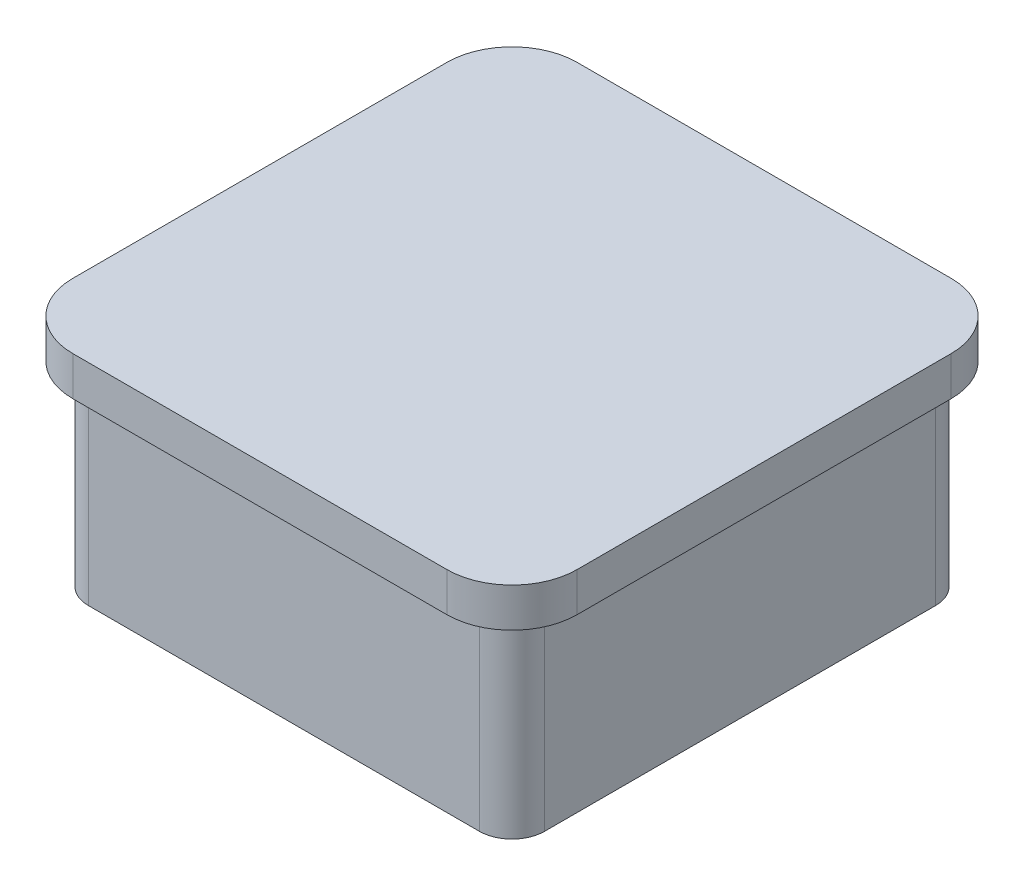
ISO-10303-21;
HEADER;
FILE_DESCRIPTION(('STEP AP214'),'2;1');
FILE_NAME('part.step','',(''),(''),'','','');
FILE_SCHEMA(('AUTOMOTIVE_DESIGN { 1 0 10303 214 1 1 1 1 }'));
ENDSEC;
DATA;
#1=APPLICATION_CONTEXT('core data for automotive mechanical design processes');
#2=APPLICATION_PROTOCOL_DEFINITION('international standard','automotive_design',2000,#1);
#3=PRODUCT_CONTEXT('',#1,'mechanical');
#4=PRODUCT('Part','Part','',(#3));
#5=PRODUCT_RELATED_PRODUCT_CATEGORY('part','',(#4));
#6=PRODUCT_DEFINITION_FORMATION('','',#4);
#7=PRODUCT_DEFINITION_CONTEXT('part definition',#1,'design');
#8=PRODUCT_DEFINITION('design','',#6,#7);
#9=PRODUCT_DEFINITION_SHAPE('','',#8);
#10=(LENGTH_UNIT() NAMED_UNIT(*) SI_UNIT(.MILLI.,.METRE.));
#11=(NAMED_UNIT(*) PLANE_ANGLE_UNIT() SI_UNIT($,.RADIAN.));
#12=(NAMED_UNIT(*) SI_UNIT($,.STERADIAN.) SOLID_ANGLE_UNIT());
#13=UNCERTAINTY_MEASURE_WITH_UNIT(LENGTH_MEASURE(1.E-05),#10,'distance_accuracy_value','');
#14=(GEOMETRIC_REPRESENTATION_CONTEXT(3) GLOBAL_UNCERTAINTY_ASSIGNED_CONTEXT((#13)) GLOBAL_UNIT_ASSIGNED_CONTEXT((#10,
#11,#12)) REPRESENTATION_CONTEXT('',''));
#15=CARTESIAN_POINT('',(0.,0.,0.));
#16=DIRECTION('',(0.,0.,1.));
#17=DIRECTION('',(1.,0.,0.));
#18=AXIS2_PLACEMENT_3D('',#15,#16,#17);
#19=CARTESIAN_POINT('',(0.,-6.,0.));
#20=DIRECTION('',(0.,-1.,0.));
#21=DIRECTION('',(0.,0.,-1.));
#22=AXIS2_PLACEMENT_3D('',#19,#20,#21);
#23=PLANE('',#22);
#24=DIRECTION('',(0.,0.,1.));
#25=VECTOR('',#24,1.);
#26=CARTESIAN_POINT('',(-38.7,-6.,38.7));
#27=LINE('',#26,#25);
#28=CARTESIAN_POINT('',(-38.7,-6.,-28.7));
#29=VERTEX_POINT('',#28);
#30=CARTESIAN_POINT('',(-38.7,-6.,28.7));
#31=VERTEX_POINT('',#30);
#32=EDGE_CURVE('E330',#29,#31,#27,.T.);
#33=ORIENTED_EDGE('',*,*,#32,.F.);
#34=CARTESIAN_POINT('',(-28.7,-6.,-28.7));
#35=DIRECTION('',(0.,-1.,0.));
#36=DIRECTION('',(0.,0.,-1.));
#37=AXIS2_PLACEMENT_3D('',#34,#35,#36);
#38=CIRCLE('',#37,10.);
#39=CARTESIAN_POINT('',(-28.7,-6.,-38.7));
#40=VERTEX_POINT('',#39);
#41=EDGE_CURVE('E368',#29,#40,#38,.T.);
#42=ORIENTED_EDGE('',*,*,#41,.T.);
#43=DIRECTION('',(-1.,0.,0.));
#44=VECTOR('',#43,1.);
#45=CARTESIAN_POINT('',(-38.7,-6.,-38.7));
#46=LINE('',#45,#44);
#47=CARTESIAN_POINT('',(28.7,-6.,-38.7));
#48=VERTEX_POINT('',#47);
#49=EDGE_CURVE('E326',#48,#40,#46,.T.);
#50=ORIENTED_EDGE('',*,*,#49,.F.);
#51=CARTESIAN_POINT('',(28.7,-6.,-28.7));
#52=DIRECTION('',(0.,-1.,0.));
#53=DIRECTION('',(0.,0.,-1.));
#54=AXIS2_PLACEMENT_3D('',#51,#52,#53);
#55=CIRCLE('',#54,10.);
#56=CARTESIAN_POINT('',(38.7,-6.,-28.7));
#57=VERTEX_POINT('',#56);
#58=EDGE_CURVE('E366',#48,#57,#55,.T.);
#59=ORIENTED_EDGE('',*,*,#58,.T.);
#60=DIRECTION('',(0.,0.,-1.));
#61=VECTOR('',#60,1.);
#62=CARTESIAN_POINT('',(38.7,-6.,38.7));
#63=LINE('',#62,#61);
#64=CARTESIAN_POINT('',(38.7,-6.,28.7));
#65=VERTEX_POINT('',#64);
#66=EDGE_CURVE('E323',#65,#57,#63,.T.);
#67=ORIENTED_EDGE('',*,*,#66,.F.);
#68=CARTESIAN_POINT('',(28.7,-6.,28.7));
#69=DIRECTION('',(0.,-1.,0.));
#70=DIRECTION('',(0.,0.,-1.));
#71=AXIS2_PLACEMENT_3D('',#68,#69,#70);
#72=CIRCLE('',#71,10.);
#73=CARTESIAN_POINT('',(28.7,-6.,38.7));
#74=VERTEX_POINT('',#73);
#75=EDGE_CURVE('E47',#65,#74,#72,.T.);
#76=ORIENTED_EDGE('',*,*,#75,.T.);
#77=DIRECTION('',(1.,0.,0.));
#78=VECTOR('',#77,1.);
#79=CARTESIAN_POINT('',(-38.7,-6.,38.7));
#80=LINE('',#79,#78);
#81=CARTESIAN_POINT('',(-28.7,-6.,38.7));
#82=VERTEX_POINT('',#81);
#83=EDGE_CURVE('E333',#82,#74,#80,.T.);
#84=ORIENTED_EDGE('',*,*,#83,.F.);
#85=CARTESIAN_POINT('',(-28.7,-6.,28.7));
#86=DIRECTION('',(0.,-1.,0.));
#87=DIRECTION('',(0.,0.,-1.));
#88=AXIS2_PLACEMENT_3D('',#85,#86,#87);
#89=CIRCLE('',#88,10.);
#90=EDGE_CURVE('E363',#82,#31,#89,.T.);
#91=ORIENTED_EDGE('',*,*,#90,.T.);
#92=EDGE_LOOP('',(#33,#42,#50,#59,#67,#76,#84,#91));
#93=FACE_BOUND('',#92,.T.);
#94=DIRECTION('',(0.,0.,-1.));
#95=VECTOR('',#94,1.);
#96=CARTESIAN_POINT('',(-35.,-6.,-30.));
#97=LINE('',#96,#95);
#98=CARTESIAN_POINT('',(-35.,-6.,30.));
#99=VERTEX_POINT('',#98);
#100=CARTESIAN_POINT('',(-35.,-6.,-30.));
#101=VERTEX_POINT('',#100);
#102=EDGE_CURVE('E287',#99,#101,#97,.T.);
#103=ORIENTED_EDGE('',*,*,#102,.F.);
#104=CARTESIAN_POINT('',(-30.,-6.,30.));
#105=DIRECTION('',(0.,-1.,0.));
#106=DIRECTION('',(0.,0.,-1.));
#107=AXIS2_PLACEMENT_3D('',#104,#105,#106);
#108=CIRCLE('',#107,5.);
#109=CARTESIAN_POINT('',(-30.,-6.,35.));
#110=VERTEX_POINT('',#109);
#111=EDGE_CURVE('E214',#110,#99,#108,.T.);
#112=ORIENTED_EDGE('',*,*,#111,.F.);
#113=DIRECTION('',(-1.,0.,0.));
#114=VECTOR('',#113,1.);
#115=CARTESIAN_POINT('',(-30.,-6.,35.));
#116=LINE('',#115,#114);
#117=CARTESIAN_POINT('',(30.,-6.,35.));
#118=VERTEX_POINT('',#117);
#119=EDGE_CURVE('E270',#118,#110,#116,.T.);
#120=ORIENTED_EDGE('',*,*,#119,.F.);
#121=CARTESIAN_POINT('',(30.,-6.,30.));
#122=DIRECTION('',(0.,-1.,0.));
#123=DIRECTION('',(0.,0.,-1.));
#124=AXIS2_PLACEMENT_3D('',#121,#122,#123);
#125=CIRCLE('',#124,5.);
#126=CARTESIAN_POINT('',(35.,-6.,30.));
#127=VERTEX_POINT('',#126);
#128=EDGE_CURVE('E297',#127,#118,#125,.T.);
#129=ORIENTED_EDGE('',*,*,#128,.F.);
#130=DIRECTION('',(0.,0.,1.));
#131=VECTOR('',#130,1.);
#132=CARTESIAN_POINT('',(35.,-6.,-30.));
#133=LINE('',#132,#131);
#134=CARTESIAN_POINT('',(35.,-6.,-30.));
#135=VERTEX_POINT('',#134);
#136=EDGE_CURVE('E295',#135,#127,#133,.T.);
#137=ORIENTED_EDGE('',*,*,#136,.F.);
#138=CARTESIAN_POINT('',(30.,-6.,-30.));
#139=DIRECTION('',(0.,-1.,0.));
#140=DIRECTION('',(0.,0.,1.));
#141=AXIS2_PLACEMENT_3D('',#138,#139,#140);
#142=CIRCLE('',#141,5.);
#143=CARTESIAN_POINT('',(30.,-6.,-35.));
#144=VERTEX_POINT('',#143);
#145=EDGE_CURVE('E293',#144,#135,#142,.T.);
#146=ORIENTED_EDGE('',*,*,#145,.F.);
#147=DIRECTION('',(1.,0.,0.));
#148=VECTOR('',#147,1.);
#149=CARTESIAN_POINT('',(-30.,-6.,-35.));
#150=LINE('',#149,#148);
#151=CARTESIAN_POINT('',(-30.,-6.,-35.));
#152=VERTEX_POINT('',#151);
#153=EDGE_CURVE('E291',#152,#144,#150,.T.);
#154=ORIENTED_EDGE('',*,*,#153,.F.);
#155=CARTESIAN_POINT('',(-30.,-6.,-30.));
#156=DIRECTION('',(0.,-1.,0.));
#157=DIRECTION('',(0.,0.,-1.));
#158=AXIS2_PLACEMENT_3D('',#155,#156,#157);
#159=CIRCLE('',#158,5.);
#160=EDGE_CURVE('E289',#101,#152,#159,.T.);
#161=ORIENTED_EDGE('',*,*,#160,.F.);
#162=EDGE_LOOP('',(#103,#112,#120,#129,#137,#146,#154,#161));
#163=FACE_BOUND('',#162,.T.);
#164=ADVANCED_FACE('F32',(#93,#163),#23,.T.);
#165=CARTESIAN_POINT('',(38.7,-6.,38.7));
#166=DIRECTION('',(1.,0.,0.));
#167=DIRECTION('',(0.,0.,-1.));
#168=AXIS2_PLACEMENT_3D('',#165,#166,#167);
#169=PLANE('',#168);
#170=ORIENTED_EDGE('',*,*,#66,.T.);
#171=DIRECTION('',(0.,1.,0.));
#172=VECTOR('',#171,1.);
#173=CARTESIAN_POINT('',(38.7,-6.,-28.7));
#174=LINE('',#173,#172);
#175=CARTESIAN_POINT('',(38.7,0.,-28.7));
#176=VERTEX_POINT('',#175);
#177=EDGE_CURVE('E372',#57,#176,#174,.T.);
#178=ORIENTED_EDGE('',*,*,#177,.T.);
#179=DIRECTION('',(0.,0.,-1.));
#180=VECTOR('',#179,1.);
#181=CARTESIAN_POINT('',(38.7,0.,38.7));
#182=LINE('',#181,#180);
#183=CARTESIAN_POINT('',(38.7,0.,28.7));
#184=VERTEX_POINT('',#183);
#185=EDGE_CURVE('E322',#184,#176,#182,.T.);
#186=ORIENTED_EDGE('',*,*,#185,.F.);
#187=DIRECTION('',(0.,1.,0.));
#188=VECTOR('',#187,1.);
#189=CARTESIAN_POINT('',(38.7,-6.,28.7));
#190=LINE('',#189,#188);
#191=EDGE_CURVE('E370',#184,#65,#190,.F.);
#192=ORIENTED_EDGE('',*,*,#191,.T.);
#193=EDGE_LOOP('',(#170,#178,#186,#192));
#194=FACE_BOUND('',#193,.T.);
#195=ADVANCED_FACE('F377',(#194),#169,.T.);
#196=CARTESIAN_POINT('',(-38.7,-6.,38.7));
#197=DIRECTION('',(0.,0.,1.));
#198=DIRECTION('',(1.,0.,0.));
#199=AXIS2_PLACEMENT_3D('',#196,#197,#198);
#200=PLANE('',#199);
#201=ORIENTED_EDGE('',*,*,#83,.T.);
#202=DIRECTION('',(0.,1.,0.));
#203=VECTOR('',#202,1.);
#204=CARTESIAN_POINT('',(28.7,-6.,38.7));
#205=LINE('',#204,#203);
#206=CARTESIAN_POINT('',(28.7,0.,38.7));
#207=VERTEX_POINT('',#206);
#208=EDGE_CURVE('E11',#74,#207,#205,.T.);
#209=ORIENTED_EDGE('',*,*,#208,.T.);
#210=DIRECTION('',(1.,0.,0.));
#211=VECTOR('',#210,1.);
#212=CARTESIAN_POINT('',(-38.7,0.,38.7));
#213=LINE('',#212,#211);
#214=CARTESIAN_POINT('',(-28.7,0.,38.7));
#215=VERTEX_POINT('',#214);
#216=EDGE_CURVE('E327',#215,#207,#213,.T.);
#217=ORIENTED_EDGE('',*,*,#216,.F.);
#218=DIRECTION('',(0.,1.,0.));
#219=VECTOR('',#218,1.);
#220=CARTESIAN_POINT('',(-28.7,-6.,38.7));
#221=LINE('',#220,#219);
#222=EDGE_CURVE('E40',#215,#82,#221,.F.);
#223=ORIENTED_EDGE('',*,*,#222,.T.);
#224=EDGE_LOOP('',(#201,#209,#217,#223));
#225=FACE_BOUND('',#224,.T.);
#226=ADVANCED_FACE('F387',(#225),#200,.T.);
#227=CARTESIAN_POINT('',(-38.7,-6.,38.7));
#228=DIRECTION('',(-1.,0.,0.));
#229=DIRECTION('',(0.,0.,1.));
#230=AXIS2_PLACEMENT_3D('',#227,#228,#229);
#231=PLANE('',#230);
#232=DIRECTION('',(0.,0.,1.));
#233=VECTOR('',#232,1.);
#234=CARTESIAN_POINT('',(-38.7,0.,38.7));
#235=LINE('',#234,#233);
#236=CARTESIAN_POINT('',(-38.7,0.,-28.7));
#237=VERTEX_POINT('',#236);
#238=CARTESIAN_POINT('',(-38.7,0.,28.7));
#239=VERTEX_POINT('',#238);
#240=EDGE_CURVE('E341',#237,#239,#235,.T.);
#241=ORIENTED_EDGE('',*,*,#240,.F.);
#242=DIRECTION('',(0.,1.,0.));
#243=VECTOR('',#242,1.);
#244=CARTESIAN_POINT('',(-38.7,-6.,-28.7));
#245=LINE('',#244,#243);
#246=EDGE_CURVE('E361',#237,#29,#245,.F.);
#247=ORIENTED_EDGE('',*,*,#246,.T.);
#248=ORIENTED_EDGE('',*,*,#32,.T.);
#249=DIRECTION('',(0.,1.,0.));
#250=VECTOR('',#249,1.);
#251=CARTESIAN_POINT('',(-38.7,-6.,28.7));
#252=LINE('',#251,#250);
#253=EDGE_CURVE('E358',#31,#239,#252,.T.);
#254=ORIENTED_EDGE('',*,*,#253,.T.);
#255=EDGE_LOOP('',(#241,#247,#248,#254));
#256=FACE_BOUND('',#255,.T.);
#257=ADVANCED_FACE('F395',(#256),#231,.T.);
#258=CARTESIAN_POINT('',(-38.7,-6.,-38.7));
#259=DIRECTION('',(0.,0.,-1.));
#260=DIRECTION('',(-1.,0.,0.));
#261=AXIS2_PLACEMENT_3D('',#258,#259,#260);
#262=PLANE('',#261);
#263=ORIENTED_EDGE('',*,*,#49,.T.);
#264=DIRECTION('',(0.,1.,0.));
#265=VECTOR('',#264,1.);
#266=CARTESIAN_POINT('',(-28.7,-6.,-38.7));
#267=LINE('',#266,#265);
#268=CARTESIAN_POINT('',(-28.7,0.,-38.7));
#269=VERTEX_POINT('',#268);
#270=EDGE_CURVE('E347',#40,#269,#267,.T.);
#271=ORIENTED_EDGE('',*,*,#270,.T.);
#272=DIRECTION('',(-1.,0.,0.));
#273=VECTOR('',#272,1.);
#274=CARTESIAN_POINT('',(-38.7,0.,-38.7));
#275=LINE('',#274,#273);
#276=CARTESIAN_POINT('',(28.7,0.,-38.7));
#277=VERTEX_POINT('',#276);
#278=EDGE_CURVE('E338',#277,#269,#275,.T.);
#279=ORIENTED_EDGE('',*,*,#278,.F.);
#280=DIRECTION('',(0.,1.,0.));
#281=VECTOR('',#280,1.);
#282=CARTESIAN_POINT('',(28.7,-6.,-38.7));
#283=LINE('',#282,#281);
#284=EDGE_CURVE('E335',#277,#48,#283,.F.);
#285=ORIENTED_EDGE('',*,*,#284,.T.);
#286=EDGE_LOOP('',(#263,#271,#279,#285));
#287=FACE_BOUND('',#286,.T.);
#288=ADVANCED_FACE('F402',(#287),#262,.T.);
#289=CARTESIAN_POINT('',(0.,0.,0.));
#290=DIRECTION('',(0.,-1.,0.));
#291=DIRECTION('',(0.,0.,-1.));
#292=AXIS2_PLACEMENT_3D('',#289,#290,#291);
#293=PLANE('',#292);
#294=ORIENTED_EDGE('',*,*,#278,.T.);
#295=CARTESIAN_POINT('',(-28.7,0.,-28.7));
#296=DIRECTION('',(0.,-1.,0.));
#297=DIRECTION('',(0.,0.,-1.));
#298=AXIS2_PLACEMENT_3D('',#295,#296,#297);
#299=CIRCLE('',#298,10.);
#300=EDGE_CURVE('E356',#269,#237,#299,.F.);
#301=ORIENTED_EDGE('',*,*,#300,.T.);
#302=ORIENTED_EDGE('',*,*,#240,.T.);
#303=CARTESIAN_POINT('',(-28.7,0.,28.7));
#304=DIRECTION('',(0.,-1.,0.));
#305=DIRECTION('',(0.,0.,-1.));
#306=AXIS2_PLACEMENT_3D('',#303,#304,#305);
#307=CIRCLE('',#306,10.);
#308=EDGE_CURVE('E350',#239,#215,#307,.F.);
#309=ORIENTED_EDGE('',*,*,#308,.T.);
#310=ORIENTED_EDGE('',*,*,#216,.T.);
#311=CARTESIAN_POINT('',(28.7,0.,28.7));
#312=DIRECTION('',(0.,-1.,0.));
#313=DIRECTION('',(0.,0.,-1.));
#314=AXIS2_PLACEMENT_3D('',#311,#312,#313);
#315=CIRCLE('',#314,10.);
#316=EDGE_CURVE('E352',#207,#184,#315,.F.);
#317=ORIENTED_EDGE('',*,*,#316,.T.);
#318=ORIENTED_EDGE('',*,*,#185,.T.);
#319=CARTESIAN_POINT('',(28.7,0.,-28.7));
#320=DIRECTION('',(0.,-1.,0.));
#321=DIRECTION('',(0.,0.,-1.));
#322=AXIS2_PLACEMENT_3D('',#319,#320,#321);
#323=CIRCLE('',#322,10.);
#324=EDGE_CURVE('E354',#176,#277,#323,.F.);
#325=ORIENTED_EDGE('',*,*,#324,.T.);
#326=EDGE_LOOP('',(#294,#301,#302,#309,#310,#317,#318,#325));
#327=FACE_BOUND('',#326,.T.);
#328=ADVANCED_FACE('F382',(#327),#293,.F.);
#329=CARTESIAN_POINT('',(-30.,-36.,30.));
#330=DIRECTION('',(0.,-1.,0.));
#331=DIRECTION('',(0.,0.,-1.));
#332=AXIS2_PLACEMENT_3D('',#329,#330,#331);
#333=PLANE('',#332);
#334=CARTESIAN_POINT('',(-30.,-36.,30.));
#335=DIRECTION('',(0.,-1.,0.));
#336=DIRECTION('',(0.,0.,-1.));
#337=AXIS2_PLACEMENT_3D('',#334,#335,#336);
#338=CIRCLE('',#337,5.);
#339=CARTESIAN_POINT('',(-30.,-36.,35.));
#340=VERTEX_POINT('',#339);
#341=CARTESIAN_POINT('',(-35.,-36.,30.));
#342=VERTEX_POINT('',#341);
#343=EDGE_CURVE('E266',#340,#342,#338,.T.);
#344=ORIENTED_EDGE('',*,*,#343,.T.);
#345=DIRECTION('',(0.,0.,-1.));
#346=VECTOR('',#345,1.);
#347=CARTESIAN_POINT('',(-35.,-36.,-30.));
#348=LINE('',#347,#346);
#349=CARTESIAN_POINT('',(-35.,-36.,-30.));
#350=VERTEX_POINT('',#349);
#351=EDGE_CURVE('E269',#342,#350,#348,.T.);
#352=ORIENTED_EDGE('',*,*,#351,.T.);
#353=CARTESIAN_POINT('',(-30.,-36.,-30.));
#354=DIRECTION('',(0.,-1.,0.));
#355=DIRECTION('',(0.,0.,-1.));
#356=AXIS2_PLACEMENT_3D('',#353,#354,#355);
#357=CIRCLE('',#356,5.);
#358=CARTESIAN_POINT('',(-30.,-36.,-35.));
#359=VERTEX_POINT('',#358);
#360=EDGE_CURVE('E272',#350,#359,#357,.T.);
#361=ORIENTED_EDGE('',*,*,#360,.T.);
#362=DIRECTION('',(1.,0.,0.));
#363=VECTOR('',#362,1.);
#364=CARTESIAN_POINT('',(-30.,-36.,-35.));
#365=LINE('',#364,#363);
#366=CARTESIAN_POINT('',(30.,-36.,-35.));
#367=VERTEX_POINT('',#366);
#368=EDGE_CURVE('E274',#359,#367,#365,.T.);
#369=ORIENTED_EDGE('',*,*,#368,.T.);
#370=CARTESIAN_POINT('',(30.,-36.,-30.));
#371=DIRECTION('',(0.,-1.,0.));
#372=DIRECTION('',(0.,0.,1.));
#373=AXIS2_PLACEMENT_3D('',#370,#371,#372);
#374=CIRCLE('',#373,5.);
#375=CARTESIAN_POINT('',(35.,-36.,-30.));
#376=VERTEX_POINT('',#375);
#377=EDGE_CURVE('E276',#367,#376,#374,.T.);
#378=ORIENTED_EDGE('',*,*,#377,.T.);
#379=DIRECTION('',(0.,0.,1.));
#380=VECTOR('',#379,1.);
#381=CARTESIAN_POINT('',(35.,-36.,-30.));
#382=LINE('',#381,#380);
#383=CARTESIAN_POINT('',(35.,-36.,30.));
#384=VERTEX_POINT('',#383);
#385=EDGE_CURVE('E278',#376,#384,#382,.T.);
#386=ORIENTED_EDGE('',*,*,#385,.T.);
#387=CARTESIAN_POINT('',(30.,-36.,30.));
#388=DIRECTION('',(0.,-1.,0.));
#389=DIRECTION('',(0.,0.,-1.));
#390=AXIS2_PLACEMENT_3D('',#387,#388,#389);
#391=CIRCLE('',#390,5.);
#392=CARTESIAN_POINT('',(30.,-36.,35.));
#393=VERTEX_POINT('',#392);
#394=EDGE_CURVE('E280',#384,#393,#391,.T.);
#395=ORIENTED_EDGE('',*,*,#394,.T.);
#396=DIRECTION('',(-1.,0.,0.));
#397=VECTOR('',#396,1.);
#398=CARTESIAN_POINT('',(-30.,-36.,35.));
#399=LINE('',#398,#397);
#400=EDGE_CURVE('E282',#393,#340,#399,.T.);
#401=ORIENTED_EDGE('',*,*,#400,.T.);
#402=EDGE_LOOP('',(#344,#352,#361,#369,#378,#386,#395,#401));
#403=FACE_BOUND('',#402,.T.);
#404=DIRECTION('',(1.,0.,0.));
#405=VECTOR('',#404,1.);
#406=CARTESIAN_POINT('',(-30.,-36.,-33.));
#407=LINE('',#406,#405);
#408=CARTESIAN_POINT('',(-30.,-36.,-33.));
#409=VERTEX_POINT('',#408);
#410=CARTESIAN_POINT('',(30.,-36.,-33.));
#411=VERTEX_POINT('',#410);
#412=EDGE_CURVE('E205',#409,#411,#407,.T.);
#413=ORIENTED_EDGE('',*,*,#412,.F.);
#414=CARTESIAN_POINT('',(-30.,-36.,-30.));
#415=DIRECTION('',(0.,-1.,0.));
#416=DIRECTION('',(0.,0.,-1.));
#417=AXIS2_PLACEMENT_3D('',#414,#415,#416);
#418=CIRCLE('',#417,3.);
#419=CARTESIAN_POINT('',(-33.,-36.,-30.));
#420=VERTEX_POINT('',#419);
#421=EDGE_CURVE('E195',#420,#409,#418,.T.);
#422=ORIENTED_EDGE('',*,*,#421,.F.);
#423=DIRECTION('',(0.,0.,-1.));
#424=VECTOR('',#423,1.);
#425=CARTESIAN_POINT('',(-33.,-36.,-30.));
#426=LINE('',#425,#424);
#427=CARTESIAN_POINT('',(-33.,-36.,30.));
#428=VERTEX_POINT('',#427);
#429=EDGE_CURVE('E233',#428,#420,#426,.T.);
#430=ORIENTED_EDGE('',*,*,#429,.F.);
#431=CARTESIAN_POINT('',(-30.,-36.,30.));
#432=DIRECTION('',(0.,-1.,0.));
#433=DIRECTION('',(0.,0.,-1.));
#434=AXIS2_PLACEMENT_3D('',#431,#432,#433);
#435=CIRCLE('',#434,3.);
#436=CARTESIAN_POINT('',(-30.,-36.,33.));
#437=VERTEX_POINT('',#436);
#438=EDGE_CURVE('E230',#437,#428,#435,.T.);
#439=ORIENTED_EDGE('',*,*,#438,.F.);
#440=DIRECTION('',(-1.,0.,0.));
#441=VECTOR('',#440,1.);
#442=CARTESIAN_POINT('',(-30.,-36.,33.));
#443=LINE('',#442,#441);
#444=CARTESIAN_POINT('',(30.,-36.,33.));
#445=VERTEX_POINT('',#444);
#446=EDGE_CURVE('E228',#445,#437,#443,.T.);
#447=ORIENTED_EDGE('',*,*,#446,.F.);
#448=CARTESIAN_POINT('',(30.,-36.,30.));
#449=DIRECTION('',(0.,-1.,0.));
#450=DIRECTION('',(0.,0.,-1.));
#451=AXIS2_PLACEMENT_3D('',#448,#449,#450);
#452=CIRCLE('',#451,3.);
#453=CARTESIAN_POINT('',(33.,-36.,30.));
#454=VERTEX_POINT('',#453);
#455=EDGE_CURVE('E226',#454,#445,#452,.T.);
#456=ORIENTED_EDGE('',*,*,#455,.F.);
#457=DIRECTION('',(0.,0.,1.));
#458=VECTOR('',#457,1.);
#459=CARTESIAN_POINT('',(33.,-36.,-30.));
#460=LINE('',#459,#458);
#461=CARTESIAN_POINT('',(33.,-36.,-30.));
#462=VERTEX_POINT('',#461);
#463=EDGE_CURVE('E222',#462,#454,#460,.T.);
#464=ORIENTED_EDGE('',*,*,#463,.F.);
#465=CARTESIAN_POINT('',(30.,-36.,-30.));
#466=DIRECTION('',(0.,-1.,0.));
#467=DIRECTION('',(0.,0.,1.));
#468=AXIS2_PLACEMENT_3D('',#465,#466,#467);
#469=CIRCLE('',#468,3.);
#470=EDGE_CURVE('E220',#411,#462,#469,.T.);
#471=ORIENTED_EDGE('',*,*,#470,.F.);
#472=EDGE_LOOP('',(#413,#422,#430,#439,#447,#456,#464,#471));
#473=FACE_BOUND('',#472,.T.);
#474=ADVANCED_FACE('F218',(#403,#473),#333,.T.);
#475=CARTESIAN_POINT('',(-30.,-36.,30.));
#476=DIRECTION('',(0.,1.,0.));
#477=DIRECTION('',(0.,0.,1.));
#478=AXIS2_PLACEMENT_3D('',#475,#476,#477);
#479=CYLINDRICAL_SURFACE('',#478,5.);
#480=ORIENTED_EDGE('',*,*,#111,.T.);
#481=DIRECTION('',(0.,1.,0.));
#482=VECTOR('',#481,1.);
#483=CARTESIAN_POINT('',(-35.,-36.,30.));
#484=LINE('',#483,#482);
#485=EDGE_CURVE('E320',#342,#99,#484,.T.);
#486=ORIENTED_EDGE('',*,*,#485,.F.);
#487=ORIENTED_EDGE('',*,*,#343,.F.);
#488=DIRECTION('',(0.,1.,0.));
#489=VECTOR('',#488,1.);
#490=CARTESIAN_POINT('',(-30.,-36.,35.));
#491=LINE('',#490,#489);
#492=EDGE_CURVE('E284',#340,#110,#491,.T.);
#493=ORIENTED_EDGE('',*,*,#492,.T.);
#494=EDGE_LOOP('',(#480,#486,#487,#493));
#495=FACE_BOUND('',#494,.T.);
#496=ADVANCED_FACE('F468',(#495),#479,.T.);
#497=CARTESIAN_POINT('',(-35.,-36.,-30.));
#498=DIRECTION('',(1.,0.,0.));
#499=DIRECTION('',(0.,0.,-1.));
#500=AXIS2_PLACEMENT_3D('',#497,#498,#499);
#501=PLANE('',#500);
#502=ORIENTED_EDGE('',*,*,#102,.T.);
#503=DIRECTION('',(0.,1.,0.));
#504=VECTOR('',#503,1.);
#505=CARTESIAN_POINT('',(-35.,-36.,-30.));
#506=LINE('',#505,#504);
#507=EDGE_CURVE('E317',#350,#101,#506,.T.);
#508=ORIENTED_EDGE('',*,*,#507,.F.);
#509=ORIENTED_EDGE('',*,*,#351,.F.);
#510=ORIENTED_EDGE('',*,*,#485,.T.);
#511=EDGE_LOOP('',(#502,#508,#509,#510));
#512=FACE_BOUND('',#511,.T.);
#513=ADVANCED_FACE('F492',(#512),#501,.F.);
#514=CARTESIAN_POINT('',(-30.,-36.,-30.));
#515=DIRECTION('',(0.,1.,0.));
#516=DIRECTION('',(0.,0.,1.));
#517=AXIS2_PLACEMENT_3D('',#514,#515,#516);
#518=CYLINDRICAL_SURFACE('',#517,5.);
#519=ORIENTED_EDGE('',*,*,#160,.T.);
#520=DIRECTION('',(0.,1.,0.));
#521=VECTOR('',#520,1.);
#522=CARTESIAN_POINT('',(-30.,-36.,-35.));
#523=LINE('',#522,#521);
#524=EDGE_CURVE('E314',#359,#152,#523,.T.);
#525=ORIENTED_EDGE('',*,*,#524,.F.);
#526=ORIENTED_EDGE('',*,*,#360,.F.);
#527=ORIENTED_EDGE('',*,*,#507,.T.);
#528=EDGE_LOOP('',(#519,#525,#526,#527));
#529=FACE_BOUND('',#528,.T.);
#530=ADVANCED_FACE('F488',(#529),#518,.T.);
#531=CARTESIAN_POINT('',(-30.,-36.,-35.));
#532=DIRECTION('',(0.,0.,1.));
#533=DIRECTION('',(1.,0.,0.));
#534=AXIS2_PLACEMENT_3D('',#531,#532,#533);
#535=PLANE('',#534);
#536=ORIENTED_EDGE('',*,*,#153,.T.);
#537=DIRECTION('',(0.,1.,0.));
#538=VECTOR('',#537,1.);
#539=CARTESIAN_POINT('',(30.,-36.,-35.));
#540=LINE('',#539,#538);
#541=EDGE_CURVE('E311',#367,#144,#540,.T.);
#542=ORIENTED_EDGE('',*,*,#541,.F.);
#543=ORIENTED_EDGE('',*,*,#368,.F.);
#544=ORIENTED_EDGE('',*,*,#524,.T.);
#545=EDGE_LOOP('',(#536,#542,#543,#544));
#546=FACE_BOUND('',#545,.T.);
#547=ADVANCED_FACE('F484',(#546),#535,.F.);
#548=CARTESIAN_POINT('',(30.,-36.,-30.));
#549=DIRECTION('',(0.,1.,0.));
#550=DIRECTION('',(0.,0.,1.));
#551=AXIS2_PLACEMENT_3D('',#548,#549,#550);
#552=CYLINDRICAL_SURFACE('',#551,5.);
#553=ORIENTED_EDGE('',*,*,#145,.T.);
#554=DIRECTION('',(0.,1.,0.));
#555=VECTOR('',#554,1.);
#556=CARTESIAN_POINT('',(35.,-36.,-30.));
#557=LINE('',#556,#555);
#558=EDGE_CURVE('E308',#376,#135,#557,.T.);
#559=ORIENTED_EDGE('',*,*,#558,.F.);
#560=ORIENTED_EDGE('',*,*,#377,.F.);
#561=ORIENTED_EDGE('',*,*,#541,.T.);
#562=EDGE_LOOP('',(#553,#559,#560,#561));
#563=FACE_BOUND('',#562,.T.);
#564=ADVANCED_FACE('F480',(#563),#552,.T.);
#565=CARTESIAN_POINT('',(35.,-36.,-30.));
#566=DIRECTION('',(-1.,0.,0.));
#567=DIRECTION('',(0.,0.,1.));
#568=AXIS2_PLACEMENT_3D('',#565,#566,#567);
#569=PLANE('',#568);
#570=ORIENTED_EDGE('',*,*,#136,.T.);
#571=DIRECTION('',(0.,1.,0.));
#572=VECTOR('',#571,1.);
#573=CARTESIAN_POINT('',(35.,-36.,30.));
#574=LINE('',#573,#572);
#575=EDGE_CURVE('E305',#384,#127,#574,.T.);
#576=ORIENTED_EDGE('',*,*,#575,.F.);
#577=ORIENTED_EDGE('',*,*,#385,.F.);
#578=ORIENTED_EDGE('',*,*,#558,.T.);
#579=EDGE_LOOP('',(#570,#576,#577,#578));
#580=FACE_BOUND('',#579,.T.);
#581=ADVANCED_FACE('F476',(#580),#569,.F.);
#582=CARTESIAN_POINT('',(30.,-36.,30.));
#583=DIRECTION('',(0.,1.,0.));
#584=DIRECTION('',(0.,0.,1.));
#585=AXIS2_PLACEMENT_3D('',#582,#583,#584);
#586=CYLINDRICAL_SURFACE('',#585,5.);
#587=ORIENTED_EDGE('',*,*,#128,.T.);
#588=DIRECTION('',(0.,1.,0.));
#589=VECTOR('',#588,1.);
#590=CARTESIAN_POINT('',(30.,-36.,35.));
#591=LINE('',#590,#589);
#592=EDGE_CURVE('E303',#393,#118,#591,.T.);
#593=ORIENTED_EDGE('',*,*,#592,.F.);
#594=ORIENTED_EDGE('',*,*,#394,.F.);
#595=ORIENTED_EDGE('',*,*,#575,.T.);
#596=EDGE_LOOP('',(#587,#593,#594,#595));
#597=FACE_BOUND('',#596,.T.);
#598=ADVANCED_FACE('F472',(#597),#586,.T.);
#599=CARTESIAN_POINT('',(-30.,-36.,35.));
#600=DIRECTION('',(0.,0.,-1.));
#601=DIRECTION('',(-1.,0.,0.));
#602=AXIS2_PLACEMENT_3D('',#599,#600,#601);
#603=PLANE('',#602);
#604=ORIENTED_EDGE('',*,*,#119,.T.);
#605=ORIENTED_EDGE('',*,*,#492,.F.);
#606=ORIENTED_EDGE('',*,*,#400,.F.);
#607=ORIENTED_EDGE('',*,*,#592,.T.);
#608=EDGE_LOOP('',(#604,#605,#606,#607));
#609=FACE_BOUND('',#608,.T.);
#610=ADVANCED_FACE('F465',(#609),#603,.F.);
#611=CARTESIAN_POINT('',(-30.,-36.,-30.));
#612=DIRECTION('',(0.,1.,0.));
#613=DIRECTION('',(0.,0.,1.));
#614=AXIS2_PLACEMENT_3D('',#611,#612,#613);
#615=CYLINDRICAL_SURFACE('',#614,3.);
#616=CARTESIAN_POINT('',(-30.,-6.,-30.));
#617=DIRECTION('',(0.,-1.,0.));
#618=DIRECTION('',(0.,0.,-1.));
#619=AXIS2_PLACEMENT_3D('',#616,#617,#618);
#620=CIRCLE('',#619,3.);
#621=CARTESIAN_POINT('',(-33.,-6.,-30.));
#622=VERTEX_POINT('',#621);
#623=CARTESIAN_POINT('',(-30.,-6.,-33.));
#624=VERTEX_POINT('',#623);
#625=EDGE_CURVE('E235',#622,#624,#620,.T.);
#626=ORIENTED_EDGE('',*,*,#625,.F.);
#627=DIRECTION('',(0.,1.,0.));
#628=VECTOR('',#627,1.);
#629=CARTESIAN_POINT('',(-33.,-36.,-30.));
#630=LINE('',#629,#628);
#631=EDGE_CURVE('E201',#420,#622,#630,.T.);
#632=ORIENTED_EDGE('',*,*,#631,.F.);
#633=ORIENTED_EDGE('',*,*,#421,.T.);
#634=DIRECTION('',(0.,1.,0.));
#635=VECTOR('',#634,1.);
#636=CARTESIAN_POINT('',(-30.,-36.,-33.));
#637=LINE('',#636,#635);
#638=EDGE_CURVE('E199',#409,#624,#637,.T.);
#639=ORIENTED_EDGE('',*,*,#638,.T.);
#640=EDGE_LOOP('',(#626,#632,#633,#639));
#641=FACE_BOUND('',#640,.T.);
#642=ADVANCED_FACE('F198',(#641),#615,.F.);
#643=CARTESIAN_POINT('',(-30.,-36.,-33.));
#644=DIRECTION('',(0.,0.,1.));
#645=DIRECTION('',(1.,0.,0.));
#646=AXIS2_PLACEMENT_3D('',#643,#644,#645);
#647=PLANE('',#646);
#648=DIRECTION('',(1.,0.,0.));
#649=VECTOR('',#648,1.);
#650=CARTESIAN_POINT('',(-30.,-6.,-33.));
#651=LINE('',#650,#649);
#652=CARTESIAN_POINT('',(30.,-6.,-33.));
#653=VERTEX_POINT('',#652);
#654=EDGE_CURVE('E213',#624,#653,#651,.T.);
#655=ORIENTED_EDGE('',*,*,#654,.F.);
#656=ORIENTED_EDGE('',*,*,#638,.F.);
#657=ORIENTED_EDGE('',*,*,#412,.T.);
#658=DIRECTION('',(0.,1.,0.));
#659=VECTOR('',#658,1.);
#660=CARTESIAN_POINT('',(30.,-36.,-33.));
#661=LINE('',#660,#659);
#662=EDGE_CURVE('E215',#411,#653,#661,.T.);
#663=ORIENTED_EDGE('',*,*,#662,.T.);
#664=EDGE_LOOP('',(#655,#656,#657,#663));
#665=FACE_BOUND('',#664,.T.);
#666=ADVANCED_FACE('F210',(#665),#647,.T.);
#667=CARTESIAN_POINT('',(30.,-36.,-30.));
#668=DIRECTION('',(0.,1.,0.));
#669=DIRECTION('',(0.,0.,1.));
#670=AXIS2_PLACEMENT_3D('',#667,#668,#669);
#671=CYLINDRICAL_SURFACE('',#670,3.);
#672=CARTESIAN_POINT('',(30.,-6.,-30.));
#673=DIRECTION('',(0.,-1.,0.));
#674=DIRECTION('',(0.,0.,1.));
#675=AXIS2_PLACEMENT_3D('',#672,#673,#674);
#676=CIRCLE('',#675,3.);
#677=CARTESIAN_POINT('',(33.,-6.,-30.));
#678=VERTEX_POINT('',#677);
#679=EDGE_CURVE('E238',#653,#678,#676,.T.);
#680=ORIENTED_EDGE('',*,*,#679,.F.);
#681=ORIENTED_EDGE('',*,*,#662,.F.);
#682=ORIENTED_EDGE('',*,*,#470,.T.);
#683=DIRECTION('',(0.,1.,0.));
#684=VECTOR('',#683,1.);
#685=CARTESIAN_POINT('',(33.,-36.,-30.));
#686=LINE('',#685,#684);
#687=EDGE_CURVE('E262',#462,#678,#686,.T.);
#688=ORIENTED_EDGE('',*,*,#687,.T.);
#689=EDGE_LOOP('',(#680,#681,#682,#688));
#690=FACE_BOUND('',#689,.T.);
#691=ADVANCED_FACE('F452',(#690),#671,.F.);
#692=CARTESIAN_POINT('',(33.,-36.,-30.));
#693=DIRECTION('',(-1.,0.,0.));
#694=DIRECTION('',(0.,0.,1.));
#695=AXIS2_PLACEMENT_3D('',#692,#693,#694);
#696=PLANE('',#695);
#697=DIRECTION('',(0.,0.,1.));
#698=VECTOR('',#697,1.);
#699=CARTESIAN_POINT('',(33.,-6.,-30.));
#700=LINE('',#699,#698);
#701=CARTESIAN_POINT('',(33.,-6.,30.));
#702=VERTEX_POINT('',#701);
#703=EDGE_CURVE('E240',#678,#702,#700,.T.);
#704=ORIENTED_EDGE('',*,*,#703,.F.);
#705=ORIENTED_EDGE('',*,*,#687,.F.);
#706=ORIENTED_EDGE('',*,*,#463,.T.);
#707=DIRECTION('',(0.,1.,0.));
#708=VECTOR('',#707,1.);
#709=CARTESIAN_POINT('',(33.,-36.,30.));
#710=LINE('',#709,#708);
#711=EDGE_CURVE('E259',#454,#702,#710,.T.);
#712=ORIENTED_EDGE('',*,*,#711,.T.);
#713=EDGE_LOOP('',(#704,#705,#706,#712));
#714=FACE_BOUND('',#713,.T.);
#715=ADVANCED_FACE('F449',(#714),#696,.T.);
#716=CARTESIAN_POINT('',(30.,-36.,30.));
#717=DIRECTION('',(0.,1.,0.));
#718=DIRECTION('',(0.,0.,1.));
#719=AXIS2_PLACEMENT_3D('',#716,#717,#718);
#720=CYLINDRICAL_SURFACE('',#719,3.);
#721=CARTESIAN_POINT('',(30.,-6.,30.));
#722=DIRECTION('',(0.,-1.,0.));
#723=DIRECTION('',(0.,0.,-1.));
#724=AXIS2_PLACEMENT_3D('',#721,#722,#723);
#725=CIRCLE('',#724,3.);
#726=CARTESIAN_POINT('',(30.,-6.,33.));
#727=VERTEX_POINT('',#726);
#728=EDGE_CURVE('E242',#702,#727,#725,.T.);
#729=ORIENTED_EDGE('',*,*,#728,.F.);
#730=ORIENTED_EDGE('',*,*,#711,.F.);
#731=ORIENTED_EDGE('',*,*,#455,.T.);
#732=DIRECTION('',(0.,1.,0.));
#733=VECTOR('',#732,1.);
#734=CARTESIAN_POINT('',(30.,-36.,33.));
#735=LINE('',#734,#733);
#736=EDGE_CURVE('E256',#445,#727,#735,.T.);
#737=ORIENTED_EDGE('',*,*,#736,.T.);
#738=EDGE_LOOP('',(#729,#730,#731,#737));
#739=FACE_BOUND('',#738,.T.);
#740=ADVANCED_FACE('F444',(#739),#720,.F.);
#741=CARTESIAN_POINT('',(-30.,-36.,33.));
#742=DIRECTION('',(0.,0.,-1.));
#743=DIRECTION('',(-1.,0.,0.));
#744=AXIS2_PLACEMENT_3D('',#741,#742,#743);
#745=PLANE('',#744);
#746=DIRECTION('',(-1.,0.,0.));
#747=VECTOR('',#746,1.);
#748=CARTESIAN_POINT('',(-30.,-6.,33.));
#749=LINE('',#748,#747);
#750=CARTESIAN_POINT('',(-30.,-6.,33.));
#751=VERTEX_POINT('',#750);
#752=EDGE_CURVE('E244',#727,#751,#749,.T.);
#753=ORIENTED_EDGE('',*,*,#752,.F.);
#754=ORIENTED_EDGE('',*,*,#736,.F.);
#755=ORIENTED_EDGE('',*,*,#446,.T.);
#756=DIRECTION('',(0.,1.,0.));
#757=VECTOR('',#756,1.);
#758=CARTESIAN_POINT('',(-30.,-36.,33.));
#759=LINE('',#758,#757);
#760=EDGE_CURVE('E253',#437,#751,#759,.T.);
#761=ORIENTED_EDGE('',*,*,#760,.T.);
#762=EDGE_LOOP('',(#753,#754,#755,#761));
#763=FACE_BOUND('',#762,.T.);
#764=ADVANCED_FACE('F440',(#763),#745,.T.);
#765=CARTESIAN_POINT('',(-30.,-36.,30.));
#766=DIRECTION('',(0.,1.,0.));
#767=DIRECTION('',(0.,0.,1.));
#768=AXIS2_PLACEMENT_3D('',#765,#766,#767);
#769=CYLINDRICAL_SURFACE('',#768,3.);
#770=CARTESIAN_POINT('',(-30.,-6.,30.));
#771=DIRECTION('',(0.,-1.,0.));
#772=DIRECTION('',(0.,0.,-1.));
#773=AXIS2_PLACEMENT_3D('',#770,#771,#772);
#774=CIRCLE('',#773,3.);
#775=CARTESIAN_POINT('',(-33.,-6.,30.));
#776=VERTEX_POINT('',#775);
#777=EDGE_CURVE('E246',#751,#776,#774,.T.);
#778=ORIENTED_EDGE('',*,*,#777,.F.);
#779=ORIENTED_EDGE('',*,*,#760,.F.);
#780=ORIENTED_EDGE('',*,*,#438,.T.);
#781=DIRECTION('',(0.,1.,0.));
#782=VECTOR('',#781,1.);
#783=CARTESIAN_POINT('',(-33.,-36.,30.));
#784=LINE('',#783,#782);
#785=EDGE_CURVE('E250',#428,#776,#784,.T.);
#786=ORIENTED_EDGE('',*,*,#785,.T.);
#787=EDGE_LOOP('',(#778,#779,#780,#786));
#788=FACE_BOUND('',#787,.T.);
#789=ADVANCED_FACE('F428',(#788),#769,.F.);
#790=CARTESIAN_POINT('',(-33.,-36.,-30.));
#791=DIRECTION('',(1.,0.,0.));
#792=DIRECTION('',(0.,0.,-1.));
#793=AXIS2_PLACEMENT_3D('',#790,#791,#792);
#794=PLANE('',#793);
#795=DIRECTION('',(0.,0.,-1.));
#796=VECTOR('',#795,1.);
#797=CARTESIAN_POINT('',(-33.,-6.,-30.));
#798=LINE('',#797,#796);
#799=EDGE_CURVE('E206',#776,#622,#798,.T.);
#800=ORIENTED_EDGE('',*,*,#799,.F.);
#801=ORIENTED_EDGE('',*,*,#785,.F.);
#802=ORIENTED_EDGE('',*,*,#429,.T.);
#803=ORIENTED_EDGE('',*,*,#631,.T.);
#804=EDGE_LOOP('',(#800,#801,#802,#803));
#805=FACE_BOUND('',#804,.T.);
#806=ADVANCED_FACE('F423',(#805),#794,.T.);
#807=ORIENTED_EDGE('',*,*,#625,.T.);
#808=ORIENTED_EDGE('',*,*,#654,.T.);
#809=ORIENTED_EDGE('',*,*,#679,.T.);
#810=ORIENTED_EDGE('',*,*,#703,.T.);
#811=ORIENTED_EDGE('',*,*,#728,.T.);
#812=ORIENTED_EDGE('',*,*,#752,.T.);
#813=ORIENTED_EDGE('',*,*,#777,.T.);
#814=ORIENTED_EDGE('',*,*,#799,.T.);
#815=EDGE_LOOP('',(#807,#808,#809,#810,#811,#812,#813,#814));
#816=FACE_BOUND('',#815,.T.);
#817=ADVANCED_FACE('F412',(#816),#23,.T.);
#818=CARTESIAN_POINT('',(-28.7,-6.,-28.7));
#819=DIRECTION('',(0.,1.,0.));
#820=DIRECTION('',(0.,0.,1.));
#821=AXIS2_PLACEMENT_3D('',#818,#819,#820);
#822=CYLINDRICAL_SURFACE('',#821,10.);
#823=ORIENTED_EDGE('',*,*,#41,.F.);
#824=ORIENTED_EDGE('',*,*,#246,.F.);
#825=ORIENTED_EDGE('',*,*,#300,.F.);
#826=ORIENTED_EDGE('',*,*,#270,.F.);
#827=EDGE_LOOP('',(#823,#824,#825,#826));
#828=FACE_BOUND('',#827,.T.);
#829=ADVANCED_FACE('F400',(#828),#822,.T.);
#830=CARTESIAN_POINT('',(28.7,-6.,-28.7));
#831=DIRECTION('',(0.,1.,0.));
#832=DIRECTION('',(0.,0.,1.));
#833=AXIS2_PLACEMENT_3D('',#830,#831,#832);
#834=CYLINDRICAL_SURFACE('',#833,10.);
#835=ORIENTED_EDGE('',*,*,#58,.F.);
#836=ORIENTED_EDGE('',*,*,#284,.F.);
#837=ORIENTED_EDGE('',*,*,#324,.F.);
#838=ORIENTED_EDGE('',*,*,#177,.F.);
#839=EDGE_LOOP('',(#835,#836,#837,#838));
#840=FACE_BOUND('',#839,.T.);
#841=ADVANCED_FACE('F405',(#840),#834,.T.);
#842=CARTESIAN_POINT('',(28.7,-6.,28.7));
#843=DIRECTION('',(0.,1.,0.));
#844=DIRECTION('',(0.,0.,1.));
#845=AXIS2_PLACEMENT_3D('',#842,#843,#844);
#846=CYLINDRICAL_SURFACE('',#845,10.);
#847=ORIENTED_EDGE('',*,*,#75,.F.);
#848=ORIENTED_EDGE('',*,*,#191,.F.);
#849=ORIENTED_EDGE('',*,*,#316,.F.);
#850=ORIENTED_EDGE('',*,*,#208,.F.);
#851=EDGE_LOOP('',(#847,#848,#849,#850));
#852=FACE_BOUND('',#851,.T.);
#853=ADVANCED_FACE('F386',(#852),#846,.T.);
#854=CARTESIAN_POINT('',(-28.7,-6.,28.7));
#855=DIRECTION('',(0.,1.,0.));
#856=DIRECTION('',(0.,0.,1.));
#857=AXIS2_PLACEMENT_3D('',#854,#855,#856);
#858=CYLINDRICAL_SURFACE('',#857,10.);
#859=ORIENTED_EDGE('',*,*,#90,.F.);
#860=ORIENTED_EDGE('',*,*,#222,.F.);
#861=ORIENTED_EDGE('',*,*,#308,.F.);
#862=ORIENTED_EDGE('',*,*,#253,.F.);
#863=EDGE_LOOP('',(#859,#860,#861,#862));
#864=FACE_BOUND('',#863,.T.);
#865=ADVANCED_FACE('F34',(#864),#858,.T.);
#866=CLOSED_SHELL('',(#164,#195,#226,#257,#288,#328,#474,#496,#513,#530,#547,#564,#581,#598,
#610,#642,#666,#691,#715,#740,#764,#789,#806,#817,#829,#841,#853,#865));
#867=MANIFOLD_SOLID_BREP('B2',#866);
#868=ADVANCED_BREP_SHAPE_REPRESENTATION('',(#18,#867),#14);
#869=SHAPE_DEFINITION_REPRESENTATION(#9,#868);
ENDSEC;
END-ISO-10303-21;
